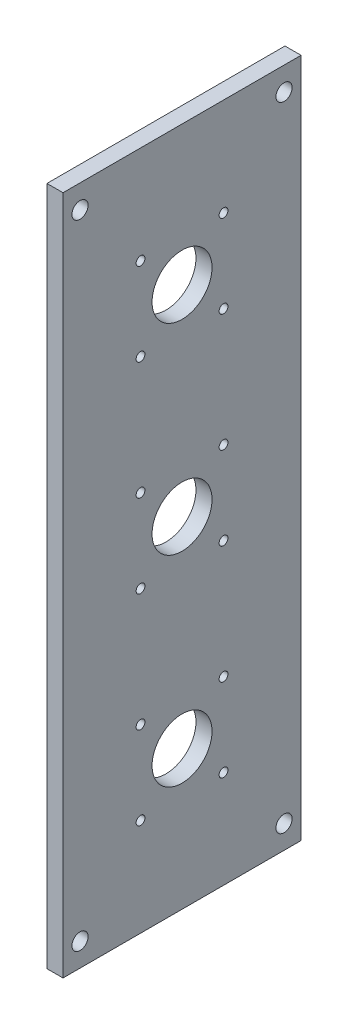
ISO-10303-21;
HEADER;
FILE_DESCRIPTION(('STEP AP214'),'2;1');
FILE_NAME('part.step','',(''),(''),'','','');
FILE_SCHEMA(('AUTOMOTIVE_DESIGN { 1 0 10303 214 1 1 1 1 }'));
ENDSEC;
DATA;
#1=APPLICATION_CONTEXT('core data for automotive mechanical design processes');
#2=APPLICATION_PROTOCOL_DEFINITION('international standard','automotive_design',2000,#1);
#3=PRODUCT_CONTEXT('',#1,'mechanical');
#4=PRODUCT('Part','Part','',(#3));
#5=PRODUCT_RELATED_PRODUCT_CATEGORY('part','',(#4));
#6=PRODUCT_DEFINITION_FORMATION('','',#4);
#7=PRODUCT_DEFINITION_CONTEXT('part definition',#1,'design');
#8=PRODUCT_DEFINITION('design','',#6,#7);
#9=PRODUCT_DEFINITION_SHAPE('','',#8);
#10=(LENGTH_UNIT() NAMED_UNIT(*) SI_UNIT(.MILLI.,.METRE.));
#11=(NAMED_UNIT(*) PLANE_ANGLE_UNIT() SI_UNIT($,.RADIAN.));
#12=(NAMED_UNIT(*) SI_UNIT($,.STERADIAN.) SOLID_ANGLE_UNIT());
#13=UNCERTAINTY_MEASURE_WITH_UNIT(LENGTH_MEASURE(1.E-05),#10,'distance_accuracy_value','');
#14=(GEOMETRIC_REPRESENTATION_CONTEXT(3) GLOBAL_UNCERTAINTY_ASSIGNED_CONTEXT((#13)) GLOBAL_UNIT_ASSIGNED_CONTEXT((#10,
#11,#12)) REPRESENTATION_CONTEXT('',''));
#15=CARTESIAN_POINT('',(0.,0.,0.));
#16=DIRECTION('',(0.,0.,1.));
#17=DIRECTION('',(1.,0.,0.));
#18=AXIS2_PLACEMENT_3D('',#15,#16,#17);
#19=CARTESIAN_POINT('',(0.,0.,0.));
#20=DIRECTION('',(-1.,0.,0.));
#21=DIRECTION('',(0.,0.,1.));
#22=AXIS2_PLACEMENT_3D('',#19,#20,#21);
#23=PLANE('',#22);
#24=CARTESIAN_POINT('',(0.,-15.5,15.5));
#25=DIRECTION('',(1.,0.,0.));
#26=DIRECTION('',(0.,0.,-1.));
#27=AXIS2_PLACEMENT_3D('',#24,#25,#26);
#28=CIRCLE('',#27,1.65);
#29=CARTESIAN_POINT('',(0.,-15.5,13.85));
#30=VERTEX_POINT('',#29);
#31=EDGE_CURVE('E251',#30,#30,#28,.T.);
#32=ORIENTED_EDGE('',*,*,#31,.F.);
#33=EDGE_LOOP('',(#32));
#34=FACE_BOUND('',#33,.T.);
#35=CARTESIAN_POINT('',(0.,15.5,15.5));
#36=DIRECTION('',(1.,0.,0.));
#37=DIRECTION('',(0.,0.,1.));
#38=AXIS2_PLACEMENT_3D('',#35,#36,#37);
#39=CIRCLE('',#38,1.65);
#40=CARTESIAN_POINT('',(0.,15.5,17.15));
#41=VERTEX_POINT('',#40);
#42=EDGE_CURVE('E262',#41,#41,#39,.T.);
#43=ORIENTED_EDGE('',*,*,#42,.F.);
#44=EDGE_LOOP('',(#43));
#45=FACE_BOUND('',#44,.T.);
#46=CARTESIAN_POINT('',(0.,15.5,-15.5));
#47=DIRECTION('',(1.,0.,0.));
#48=DIRECTION('',(0.,0.,-1.));
#49=AXIS2_PLACEMENT_3D('',#46,#47,#48);
#50=CIRCLE('',#49,1.65);
#51=CARTESIAN_POINT('',(0.,15.5,-17.15));
#52=VERTEX_POINT('',#51);
#53=EDGE_CURVE('E266',#52,#52,#50,.T.);
#54=ORIENTED_EDGE('',*,*,#53,.F.);
#55=EDGE_LOOP('',(#54));
#56=FACE_BOUND('',#55,.T.);
#57=CARTESIAN_POINT('',(0.,-15.5,-15.5));
#58=DIRECTION('',(1.,0.,0.));
#59=DIRECTION('',(0.,0.,1.));
#60=AXIS2_PLACEMENT_3D('',#57,#58,#59);
#61=CIRCLE('',#60,1.65);
#62=CARTESIAN_POINT('',(0.,-15.5,-13.85));
#63=VERTEX_POINT('',#62);
#64=EDGE_CURVE('E271',#63,#63,#61,.T.);
#65=ORIENTED_EDGE('',*,*,#64,.F.);
#66=EDGE_LOOP('',(#65));
#67=FACE_BOUND('',#66,.T.);
#68=CARTESIAN_POINT('',(0.,75.,0.));
#69=DIRECTION('',(1.,0.,0.));
#70=DIRECTION('',(0.,0.,-1.));
#71=AXIS2_PLACEMENT_3D('',#68,#69,#70);
#72=CIRCLE('',#71,11.2);
#73=CARTESIAN_POINT('',(0.,75.,-11.2));
#74=VERTEX_POINT('',#73);
#75=EDGE_CURVE('E276',#74,#74,#72,.T.);
#76=ORIENTED_EDGE('',*,*,#75,.F.);
#77=EDGE_LOOP('',(#76));
#78=FACE_BOUND('',#77,.T.);
#79=CARTESIAN_POINT('',(0.,59.5,15.5));
#80=DIRECTION('',(1.,0.,0.));
#81=DIRECTION('',(0.,0.,-1.));
#82=AXIS2_PLACEMENT_3D('',#79,#80,#81);
#83=CIRCLE('',#82,1.65);
#84=CARTESIAN_POINT('',(0.,59.5,13.85));
#85=VERTEX_POINT('',#84);
#86=EDGE_CURVE('E283',#85,#85,#83,.T.);
#87=ORIENTED_EDGE('',*,*,#86,.F.);
#88=EDGE_LOOP('',(#87));
#89=FACE_BOUND('',#88,.T.);
#90=CARTESIAN_POINT('',(0.,90.5,15.5));
#91=DIRECTION('',(1.,0.,0.));
#92=DIRECTION('',(0.,0.,1.));
#93=AXIS2_PLACEMENT_3D('',#90,#91,#92);
#94=CIRCLE('',#93,1.65);
#95=CARTESIAN_POINT('',(0.,90.5,17.15));
#96=VERTEX_POINT('',#95);
#97=EDGE_CURVE('E293',#96,#96,#94,.T.);
#98=ORIENTED_EDGE('',*,*,#97,.F.);
#99=EDGE_LOOP('',(#98));
#100=FACE_BOUND('',#99,.T.);
#101=CARTESIAN_POINT('',(0.,90.5,-15.5));
#102=DIRECTION('',(1.,0.,0.));
#103=DIRECTION('',(0.,0.,-1.));
#104=AXIS2_PLACEMENT_3D('',#101,#102,#103);
#105=CIRCLE('',#104,1.65);
#106=CARTESIAN_POINT('',(0.,90.5,-17.15));
#107=VERTEX_POINT('',#106);
#108=EDGE_CURVE('E300',#107,#107,#105,.T.);
#109=ORIENTED_EDGE('',*,*,#108,.F.);
#110=EDGE_LOOP('',(#109));
#111=FACE_BOUND('',#110,.T.);
#112=CARTESIAN_POINT('',(0.,-90.5,-15.5));
#113=DIRECTION('',(1.,0.,0.));
#114=DIRECTION('',(0.,0.,1.));
#115=AXIS2_PLACEMENT_3D('',#112,#113,#114);
#116=CIRCLE('',#115,1.65);
#117=CARTESIAN_POINT('',(0.,-90.5,-13.85));
#118=VERTEX_POINT('',#117);
#119=EDGE_CURVE('E222',#118,#118,#116,.T.);
#120=ORIENTED_EDGE('',*,*,#119,.F.);
#121=EDGE_LOOP('',(#120));
#122=FACE_BOUND('',#121,.T.);
#123=CARTESIAN_POINT('',(0.,-59.5,-15.5));
#124=DIRECTION('',(1.,0.,0.));
#125=DIRECTION('',(0.,0.,-1.));
#126=AXIS2_PLACEMENT_3D('',#123,#124,#125);
#127=CIRCLE('',#126,1.65);
#128=CARTESIAN_POINT('',(0.,-59.5,-17.15));
#129=VERTEX_POINT('',#128);
#130=EDGE_CURVE('E220',#129,#129,#127,.T.);
#131=ORIENTED_EDGE('',*,*,#130,.F.);
#132=EDGE_LOOP('',(#131));
#133=FACE_BOUND('',#132,.T.);
#134=CARTESIAN_POINT('',(0.,-59.5,15.5));
#135=DIRECTION('',(1.,0.,0.));
#136=DIRECTION('',(0.,0.,1.));
#137=AXIS2_PLACEMENT_3D('',#134,#135,#136);
#138=CIRCLE('',#137,1.65);
#139=CARTESIAN_POINT('',(0.,-59.5,17.15));
#140=VERTEX_POINT('',#139);
#141=EDGE_CURVE('E225',#140,#140,#138,.T.);
#142=ORIENTED_EDGE('',*,*,#141,.F.);
#143=EDGE_LOOP('',(#142));
#144=FACE_BOUND('',#143,.T.);
#145=CARTESIAN_POINT('',(0.,-90.5,15.5));
#146=DIRECTION('',(1.,0.,0.));
#147=DIRECTION('',(0.,0.,-1.));
#148=AXIS2_PLACEMENT_3D('',#145,#146,#147);
#149=CIRCLE('',#148,1.65);
#150=CARTESIAN_POINT('',(0.,-90.5,13.85));
#151=VERTEX_POINT('',#150);
#152=EDGE_CURVE('E246',#151,#151,#149,.T.);
#153=ORIENTED_EDGE('',*,*,#152,.F.);
#154=EDGE_LOOP('',(#153));
#155=FACE_BOUND('',#154,.T.);
#156=CARTESIAN_POINT('',(0.,-75.,0.));
#157=DIRECTION('',(1.,0.,0.));
#158=DIRECTION('',(0.,0.,-1.));
#159=AXIS2_PLACEMENT_3D('',#156,#157,#158);
#160=CIRCLE('',#159,11.2);
#161=CARTESIAN_POINT('',(0.,-75.,-11.2));
#162=VERTEX_POINT('',#161);
#163=EDGE_CURVE('E239',#162,#162,#160,.T.);
#164=ORIENTED_EDGE('',*,*,#163,.F.);
#165=EDGE_LOOP('',(#164));
#166=FACE_BOUND('',#165,.T.);
#167=CARTESIAN_POINT('',(0.,59.5,-15.5));
#168=DIRECTION('',(1.,0.,0.));
#169=DIRECTION('',(0.,0.,1.));
#170=AXIS2_PLACEMENT_3D('',#167,#168,#169);
#171=CIRCLE('',#170,1.65);
#172=CARTESIAN_POINT('',(0.,59.5,-13.85));
#173=VERTEX_POINT('',#172);
#174=EDGE_CURVE('E231',#173,#173,#171,.T.);
#175=ORIENTED_EDGE('',*,*,#174,.F.);
#176=EDGE_LOOP('',(#175));
#177=FACE_BOUND('',#176,.T.);
#178=CARTESIAN_POINT('',(0.,0.,0.));
#179=DIRECTION('',(1.,0.,0.));
#180=DIRECTION('',(0.,0.,-1.));
#181=AXIS2_PLACEMENT_3D('',#178,#179,#180);
#182=CIRCLE('',#181,11.2);
#183=CARTESIAN_POINT('',(0.,0.,-11.2));
#184=VERTEX_POINT('',#183);
#185=EDGE_CURVE('E260',#184,#184,#182,.T.);
#186=ORIENTED_EDGE('',*,*,#185,.F.);
#187=EDGE_LOOP('',(#186));
#188=FACE_BOUND('',#187,.T.);
#189=CARTESIAN_POINT('',(0.,118.2625,38.1));
#190=DIRECTION('',(1.,0.,0.));
#191=DIRECTION('',(0.,0.,-1.));
#192=AXIS2_PLACEMENT_3D('',#189,#190,#191);
#193=CIRCLE('',#192,3.0226);
#194=CARTESIAN_POINT('',(0.,118.2625,35.0774));
#195=VERTEX_POINT('',#194);
#196=EDGE_CURVE('E323',#195,#195,#193,.T.);
#197=ORIENTED_EDGE('',*,*,#196,.F.);
#198=EDGE_LOOP('',(#197));
#199=FACE_BOUND('',#198,.T.);
#200=DIRECTION('',(0.,0.,1.));
#201=VECTOR('',#200,1.);
#202=CARTESIAN_POINT('',(0.,127.,-44.45));
#203=LINE('',#202,#201);
#204=CARTESIAN_POINT('',(0.,127.,-44.45));
#205=VERTEX_POINT('',#204);
#206=CARTESIAN_POINT('',(0.,127.,44.45));
#207=VERTEX_POINT('',#206);
#208=EDGE_CURVE('E102',#205,#207,#203,.T.);
#209=ORIENTED_EDGE('',*,*,#208,.T.);
#210=DIRECTION('',(0.,-1.,0.));
#211=VECTOR('',#210,1.);
#212=CARTESIAN_POINT('',(0.,-127.,44.45));
#213=LINE('',#212,#211);
#214=CARTESIAN_POINT('',(0.,-127.,44.45));
#215=VERTEX_POINT('',#214);
#216=EDGE_CURVE('E108',#207,#215,#213,.T.);
#217=ORIENTED_EDGE('',*,*,#216,.T.);
#218=DIRECTION('',(0.,0.,-1.));
#219=VECTOR('',#218,1.);
#220=CARTESIAN_POINT('',(0.,-127.,-44.45));
#221=LINE('',#220,#219);
#222=CARTESIAN_POINT('',(0.,-127.,-44.45));
#223=VERTEX_POINT('',#222);
#224=EDGE_CURVE('E88',#215,#223,#221,.T.);
#225=ORIENTED_EDGE('',*,*,#224,.T.);
#226=DIRECTION('',(0.,1.,0.));
#227=VECTOR('',#226,1.);
#228=CARTESIAN_POINT('',(0.,-127.,-44.45));
#229=LINE('',#228,#227);
#230=EDGE_CURVE('E99',#223,#205,#229,.T.);
#231=ORIENTED_EDGE('',*,*,#230,.T.);
#232=EDGE_LOOP('',(#209,#217,#225,#231));
#233=FACE_BOUND('',#232,.T.);
#234=CARTESIAN_POINT('',(0.,118.2625,-38.1));
#235=DIRECTION('',(1.,0.,0.));
#236=DIRECTION('',(0.,0.,-1.));
#237=AXIS2_PLACEMENT_3D('',#234,#235,#236);
#238=CIRCLE('',#237,3.0226);
#239=CARTESIAN_POINT('',(0.,118.2625,-41.1226));
#240=VERTEX_POINT('',#239);
#241=EDGE_CURVE('E316',#240,#240,#238,.T.);
#242=ORIENTED_EDGE('',*,*,#241,.F.);
#243=EDGE_LOOP('',(#242));
#244=FACE_BOUND('',#243,.T.);
#245=CARTESIAN_POINT('',(0.,-118.2625,-38.1));
#246=DIRECTION('',(1.,0.,0.));
#247=DIRECTION('',(0.,0.,-1.));
#248=AXIS2_PLACEMENT_3D('',#245,#246,#247);
#249=CIRCLE('',#248,3.0226);
#250=CARTESIAN_POINT('',(0.,-118.2625,-41.1226));
#251=VERTEX_POINT('',#250);
#252=EDGE_CURVE('E312',#251,#251,#249,.T.);
#253=ORIENTED_EDGE('',*,*,#252,.F.);
#254=EDGE_LOOP('',(#253));
#255=FACE_BOUND('',#254,.T.);
#256=CARTESIAN_POINT('',(0.,-118.2625,38.1));
#257=DIRECTION('',(1.,0.,0.));
#258=DIRECTION('',(0.,0.,-1.));
#259=AXIS2_PLACEMENT_3D('',#256,#257,#258);
#260=CIRCLE('',#259,3.0226);
#261=CARTESIAN_POINT('',(0.,-118.2625,35.0774));
#262=VERTEX_POINT('',#261);
#263=EDGE_CURVE('E304',#262,#262,#260,.T.);
#264=ORIENTED_EDGE('',*,*,#263,.F.);
#265=EDGE_LOOP('',(#264));
#266=FACE_BOUND('',#265,.T.);
#267=ADVANCED_FACE('F39',(#34,#45,#56,#67,#78,#89,#100,#111,#122,#133,#144,#155,#166,#177,#188,
#199,#233,#244,#255,#266),#23,.F.);
#268=CARTESIAN_POINT('',(-6.,127.,-44.45));
#269=DIRECTION('',(0.,1.,0.));
#270=DIRECTION('',(0.,0.,1.));
#271=AXIS2_PLACEMENT_3D('',#268,#269,#270);
#272=PLANE('',#271);
#273=ORIENTED_EDGE('',*,*,#208,.F.);
#274=DIRECTION('',(1.,0.,0.));
#275=VECTOR('',#274,1.);
#276=CARTESIAN_POINT('',(-6.,127.,-44.45));
#277=LINE('',#276,#275);
#278=CARTESIAN_POINT('',(-6.,127.,-44.45));
#279=VERTEX_POINT('',#278);
#280=EDGE_CURVE('E11',#279,#205,#277,.T.);
#281=ORIENTED_EDGE('',*,*,#280,.F.);
#282=DIRECTION('',(0.,0.,1.));
#283=VECTOR('',#282,1.);
#284=CARTESIAN_POINT('',(-6.,127.,-44.45));
#285=LINE('',#284,#283);
#286=CARTESIAN_POINT('',(-6.,127.,44.45));
#287=VERTEX_POINT('',#286);
#288=EDGE_CURVE('E96',#279,#287,#285,.T.);
#289=ORIENTED_EDGE('',*,*,#288,.T.);
#290=DIRECTION('',(1.,0.,0.));
#291=VECTOR('',#290,1.);
#292=CARTESIAN_POINT('',(-6.,127.,44.45));
#293=LINE('',#292,#291);
#294=EDGE_CURVE('E43',#287,#207,#293,.T.);
#295=ORIENTED_EDGE('',*,*,#294,.T.);
#296=EDGE_LOOP('',(#273,#281,#289,#295));
#297=FACE_BOUND('',#296,.T.);
#298=ADVANCED_FACE('F41',(#297),#272,.T.);
#299=CARTESIAN_POINT('',(-6.,-127.,-44.45));
#300=DIRECTION('',(0.,0.,-1.));
#301=DIRECTION('',(-1.,0.,0.));
#302=AXIS2_PLACEMENT_3D('',#299,#300,#301);
#303=PLANE('',#302);
#304=ORIENTED_EDGE('',*,*,#230,.F.);
#305=DIRECTION('',(1.,0.,0.));
#306=VECTOR('',#305,1.);
#307=CARTESIAN_POINT('',(-6.,-127.,-44.45));
#308=LINE('',#307,#306);
#309=CARTESIAN_POINT('',(-6.,-127.,-44.45));
#310=VERTEX_POINT('',#309);
#311=EDGE_CURVE('E47',#310,#223,#308,.T.);
#312=ORIENTED_EDGE('',*,*,#311,.F.);
#313=DIRECTION('',(0.,1.,0.));
#314=VECTOR('',#313,1.);
#315=CARTESIAN_POINT('',(-6.,-127.,-44.45));
#316=LINE('',#315,#314);
#317=EDGE_CURVE('E92',#310,#279,#316,.T.);
#318=ORIENTED_EDGE('',*,*,#317,.T.);
#319=ORIENTED_EDGE('',*,*,#280,.T.);
#320=EDGE_LOOP('',(#304,#312,#318,#319));
#321=FACE_BOUND('',#320,.T.);
#322=ADVANCED_FACE('F116',(#321),#303,.T.);
#323=CARTESIAN_POINT('',(-6.,-127.,-44.45));
#324=DIRECTION('',(0.,-1.,0.));
#325=DIRECTION('',(0.,0.,-1.));
#326=AXIS2_PLACEMENT_3D('',#323,#324,#325);
#327=PLANE('',#326);
#328=ORIENTED_EDGE('',*,*,#224,.F.);
#329=DIRECTION('',(1.,0.,0.));
#330=VECTOR('',#329,1.);
#331=CARTESIAN_POINT('',(-6.,-127.,44.45));
#332=LINE('',#331,#330);
#333=CARTESIAN_POINT('',(-6.,-127.,44.45));
#334=VERTEX_POINT('',#333);
#335=EDGE_CURVE('E83',#334,#215,#332,.T.);
#336=ORIENTED_EDGE('',*,*,#335,.F.);
#337=DIRECTION('',(0.,0.,-1.));
#338=VECTOR('',#337,1.);
#339=CARTESIAN_POINT('',(-6.,-127.,-44.45));
#340=LINE('',#339,#338);
#341=EDGE_CURVE('E90',#334,#310,#340,.T.);
#342=ORIENTED_EDGE('',*,*,#341,.T.);
#343=ORIENTED_EDGE('',*,*,#311,.T.);
#344=EDGE_LOOP('',(#328,#336,#342,#343));
#345=FACE_BOUND('',#344,.T.);
#346=ADVANCED_FACE('F89',(#345),#327,.T.);
#347=CARTESIAN_POINT('',(-6.,-127.,44.45));
#348=DIRECTION('',(0.,0.,1.));
#349=DIRECTION('',(1.,0.,0.));
#350=AXIS2_PLACEMENT_3D('',#347,#348,#349);
#351=PLANE('',#350);
#352=ORIENTED_EDGE('',*,*,#216,.F.);
#353=ORIENTED_EDGE('',*,*,#294,.F.);
#354=DIRECTION('',(0.,-1.,0.));
#355=VECTOR('',#354,1.);
#356=CARTESIAN_POINT('',(-6.,-127.,44.45));
#357=LINE('',#356,#355);
#358=EDGE_CURVE('E93',#287,#334,#357,.T.);
#359=ORIENTED_EDGE('',*,*,#358,.T.);
#360=ORIENTED_EDGE('',*,*,#335,.T.);
#361=EDGE_LOOP('',(#352,#353,#359,#360));
#362=FACE_BOUND('',#361,.T.);
#363=ADVANCED_FACE('F97',(#362),#351,.T.);
#364=CARTESIAN_POINT('',(-6.,0.,0.));
#365=DIRECTION('',(-1.,0.,0.));
#366=DIRECTION('',(0.,0.,1.));
#367=AXIS2_PLACEMENT_3D('',#364,#365,#366);
#368=PLANE('',#367);
#369=CARTESIAN_POINT('',(-6.,-15.5,15.5));
#370=DIRECTION('',(1.,0.,0.));
#371=DIRECTION('',(0.,0.,-1.));
#372=AXIS2_PLACEMENT_3D('',#369,#370,#371);
#373=CIRCLE('',#372,1.65);
#374=CARTESIAN_POINT('',(-6.,-15.5,13.85));
#375=VERTEX_POINT('',#374);
#376=EDGE_CURVE('E259',#375,#375,#373,.T.);
#377=ORIENTED_EDGE('',*,*,#376,.T.);
#378=EDGE_LOOP('',(#377));
#379=FACE_BOUND('',#378,.T.);
#380=CARTESIAN_POINT('',(-6.,15.5,15.5));
#381=DIRECTION('',(1.,0.,0.));
#382=DIRECTION('',(0.,0.,1.));
#383=AXIS2_PLACEMENT_3D('',#380,#381,#382);
#384=CIRCLE('',#383,1.65);
#385=CARTESIAN_POINT('',(-6.,15.5,17.15));
#386=VERTEX_POINT('',#385);
#387=EDGE_CURVE('E261',#386,#386,#384,.T.);
#388=ORIENTED_EDGE('',*,*,#387,.T.);
#389=EDGE_LOOP('',(#388));
#390=FACE_BOUND('',#389,.T.);
#391=CARTESIAN_POINT('',(-6.,15.5,-15.5));
#392=DIRECTION('',(1.,0.,0.));
#393=DIRECTION('',(0.,0.,-1.));
#394=AXIS2_PLACEMENT_3D('',#391,#392,#393);
#395=CIRCLE('',#394,1.65);
#396=CARTESIAN_POINT('',(-6.,15.5,-17.15));
#397=VERTEX_POINT('',#396);
#398=EDGE_CURVE('E267',#397,#397,#395,.T.);
#399=ORIENTED_EDGE('',*,*,#398,.T.);
#400=EDGE_LOOP('',(#399));
#401=FACE_BOUND('',#400,.T.);
#402=CARTESIAN_POINT('',(-6.,-15.5,-15.5));
#403=DIRECTION('',(1.,0.,0.));
#404=DIRECTION('',(0.,0.,1.));
#405=AXIS2_PLACEMENT_3D('',#402,#403,#404);
#406=CIRCLE('',#405,1.65);
#407=CARTESIAN_POINT('',(-6.,-15.5,-13.85));
#408=VERTEX_POINT('',#407);
#409=EDGE_CURVE('E277',#408,#408,#406,.T.);
#410=ORIENTED_EDGE('',*,*,#409,.T.);
#411=EDGE_LOOP('',(#410));
#412=FACE_BOUND('',#411,.T.);
#413=CARTESIAN_POINT('',(-6.,75.,0.));
#414=DIRECTION('',(1.,0.,0.));
#415=DIRECTION('',(0.,0.,-1.));
#416=AXIS2_PLACEMENT_3D('',#413,#414,#415);
#417=CIRCLE('',#416,11.2);
#418=CARTESIAN_POINT('',(-6.,75.,-11.2));
#419=VERTEX_POINT('',#418);
#420=EDGE_CURVE('E284',#419,#419,#417,.T.);
#421=ORIENTED_EDGE('',*,*,#420,.T.);
#422=EDGE_LOOP('',(#421));
#423=FACE_BOUND('',#422,.T.);
#424=CARTESIAN_POINT('',(-6.,59.5,15.5));
#425=DIRECTION('',(1.,0.,0.));
#426=DIRECTION('',(0.,0.,-1.));
#427=AXIS2_PLACEMENT_3D('',#424,#425,#426);
#428=CIRCLE('',#427,1.65);
#429=CARTESIAN_POINT('',(-6.,59.5,13.85));
#430=VERTEX_POINT('',#429);
#431=EDGE_CURVE('E290',#430,#430,#428,.T.);
#432=ORIENTED_EDGE('',*,*,#431,.T.);
#433=EDGE_LOOP('',(#432));
#434=FACE_BOUND('',#433,.T.);
#435=CARTESIAN_POINT('',(-6.,90.5,15.5));
#436=DIRECTION('',(1.,0.,0.));
#437=DIRECTION('',(0.,0.,1.));
#438=AXIS2_PLACEMENT_3D('',#435,#436,#437);
#439=CIRCLE('',#438,1.65);
#440=CARTESIAN_POINT('',(-6.,90.5,17.15));
#441=VERTEX_POINT('',#440);
#442=EDGE_CURVE('E295',#441,#441,#439,.T.);
#443=ORIENTED_EDGE('',*,*,#442,.T.);
#444=EDGE_LOOP('',(#443));
#445=FACE_BOUND('',#444,.T.);
#446=CARTESIAN_POINT('',(-6.,90.5,-15.5));
#447=DIRECTION('',(1.,0.,0.));
#448=DIRECTION('',(0.,0.,-1.));
#449=AXIS2_PLACEMENT_3D('',#446,#447,#448);
#450=CIRCLE('',#449,1.65);
#451=CARTESIAN_POINT('',(-6.,90.5,-17.15));
#452=VERTEX_POINT('',#451);
#453=EDGE_CURVE('E236',#452,#452,#450,.T.);
#454=ORIENTED_EDGE('',*,*,#453,.T.);
#455=EDGE_LOOP('',(#454));
#456=FACE_BOUND('',#455,.T.);
#457=CARTESIAN_POINT('',(-6.,-90.5,-15.5));
#458=DIRECTION('',(1.,0.,0.));
#459=DIRECTION('',(0.,0.,1.));
#460=AXIS2_PLACEMENT_3D('',#457,#458,#459);
#461=CIRCLE('',#460,1.65);
#462=CARTESIAN_POINT('',(-6.,-90.5,-13.85));
#463=VERTEX_POINT('',#462);
#464=EDGE_CURVE('E229',#463,#463,#461,.T.);
#465=ORIENTED_EDGE('',*,*,#464,.T.);
#466=EDGE_LOOP('',(#465));
#467=FACE_BOUND('',#466,.T.);
#468=CARTESIAN_POINT('',(-6.,-59.5,-15.5));
#469=DIRECTION('',(1.,0.,0.));
#470=DIRECTION('',(0.,0.,-1.));
#471=AXIS2_PLACEMENT_3D('',#468,#469,#470);
#472=CIRCLE('',#471,1.65);
#473=CARTESIAN_POINT('',(-6.,-59.5,-17.15));
#474=VERTEX_POINT('',#473);
#475=EDGE_CURVE('E213',#474,#474,#472,.T.);
#476=ORIENTED_EDGE('',*,*,#475,.T.);
#477=EDGE_LOOP('',(#476));
#478=FACE_BOUND('',#477,.T.);
#479=CARTESIAN_POINT('',(-6.,-59.5,15.5));
#480=DIRECTION('',(1.,0.,0.));
#481=DIRECTION('',(0.,0.,1.));
#482=AXIS2_PLACEMENT_3D('',#479,#480,#481);
#483=CIRCLE('',#482,1.65);
#484=CARTESIAN_POINT('',(-6.,-59.5,17.15));
#485=VERTEX_POINT('',#484);
#486=EDGE_CURVE('E218',#485,#485,#483,.T.);
#487=ORIENTED_EDGE('',*,*,#486,.T.);
#488=EDGE_LOOP('',(#487));
#489=FACE_BOUND('',#488,.T.);
#490=CARTESIAN_POINT('',(-6.,-90.5,15.5));
#491=DIRECTION('',(1.,0.,0.));
#492=DIRECTION('',(0.,0.,-1.));
#493=AXIS2_PLACEMENT_3D('',#490,#491,#492);
#494=CIRCLE('',#493,1.65);
#495=CARTESIAN_POINT('',(-6.,-90.5,13.85));
#496=VERTEX_POINT('',#495);
#497=EDGE_CURVE('E248',#496,#496,#494,.T.);
#498=ORIENTED_EDGE('',*,*,#497,.T.);
#499=EDGE_LOOP('',(#498));
#500=FACE_BOUND('',#499,.T.);
#501=CARTESIAN_POINT('',(-6.,-75.,0.));
#502=DIRECTION('',(1.,0.,0.));
#503=DIRECTION('',(0.,0.,-1.));
#504=AXIS2_PLACEMENT_3D('',#501,#502,#503);
#505=CIRCLE('',#504,11.2);
#506=CARTESIAN_POINT('',(-6.,-75.,-11.2));
#507=VERTEX_POINT('',#506);
#508=EDGE_CURVE('E243',#507,#507,#505,.T.);
#509=ORIENTED_EDGE('',*,*,#508,.T.);
#510=EDGE_LOOP('',(#509));
#511=FACE_BOUND('',#510,.T.);
#512=CARTESIAN_POINT('',(-6.,59.5,-15.5));
#513=DIRECTION('',(1.,0.,0.));
#514=DIRECTION('',(0.,0.,1.));
#515=AXIS2_PLACEMENT_3D('',#512,#513,#514);
#516=CIRCLE('',#515,1.65);
#517=CARTESIAN_POINT('',(-6.,59.5,-13.85));
#518=VERTEX_POINT('',#517);
#519=EDGE_CURVE('E240',#518,#518,#516,.T.);
#520=ORIENTED_EDGE('',*,*,#519,.T.);
#521=EDGE_LOOP('',(#520));
#522=FACE_BOUND('',#521,.T.);
#523=CARTESIAN_POINT('',(-6.,0.,0.));
#524=DIRECTION('',(1.,0.,0.));
#525=DIRECTION('',(0.,0.,-1.));
#526=AXIS2_PLACEMENT_3D('',#523,#524,#525);
#527=CIRCLE('',#526,11.2);
#528=CARTESIAN_POINT('',(-6.,0.,-11.2));
#529=VERTEX_POINT('',#528);
#530=EDGE_CURVE('E305',#529,#529,#527,.T.);
#531=ORIENTED_EDGE('',*,*,#530,.T.);
#532=EDGE_LOOP('',(#531));
#533=FACE_BOUND('',#532,.T.);
#534=CARTESIAN_POINT('',(-6.,-118.2625,38.1));
#535=DIRECTION('',(-1.,0.,0.));
#536=DIRECTION('',(0.,0.,1.));
#537=AXIS2_PLACEMENT_3D('',#534,#535,#536);
#538=CIRCLE('',#537,3.0226);
#539=CARTESIAN_POINT('',(-6.,-118.2625,41.1226));
#540=VERTEX_POINT('',#539);
#541=EDGE_CURVE('E309',#540,#540,#538,.T.);
#542=ORIENTED_EDGE('',*,*,#541,.F.);
#543=EDGE_LOOP('',(#542));
#544=FACE_BOUND('',#543,.T.);
#545=CARTESIAN_POINT('',(-6.,-118.2625,-38.1));
#546=DIRECTION('',(-1.,0.,0.));
#547=DIRECTION('',(0.,0.,1.));
#548=AXIS2_PLACEMENT_3D('',#545,#546,#547);
#549=CIRCLE('',#548,3.0226);
#550=CARTESIAN_POINT('',(-6.,-118.2625,-35.0774));
#551=VERTEX_POINT('',#550);
#552=EDGE_CURVE('E317',#551,#551,#549,.T.);
#553=ORIENTED_EDGE('',*,*,#552,.F.);
#554=EDGE_LOOP('',(#553));
#555=FACE_BOUND('',#554,.T.);
#556=CARTESIAN_POINT('',(-6.,118.2625,-38.1));
#557=DIRECTION('',(-1.,0.,0.));
#558=DIRECTION('',(0.,0.,1.));
#559=AXIS2_PLACEMENT_3D('',#556,#557,#558);
#560=CIRCLE('',#559,3.0226);
#561=CARTESIAN_POINT('',(-6.,118.2625,-35.0774));
#562=VERTEX_POINT('',#561);
#563=EDGE_CURVE('E325',#562,#562,#560,.T.);
#564=ORIENTED_EDGE('',*,*,#563,.F.);
#565=EDGE_LOOP('',(#564));
#566=FACE_BOUND('',#565,.T.);
#567=CARTESIAN_POINT('',(-6.,118.2625,38.1));
#568=DIRECTION('',(-1.,0.,0.));
#569=DIRECTION('',(0.,0.,1.));
#570=AXIS2_PLACEMENT_3D('',#567,#568,#569);
#571=CIRCLE('',#570,3.0226);
#572=CARTESIAN_POINT('',(-6.,118.2625,41.1226));
#573=VERTEX_POINT('',#572);
#574=EDGE_CURVE('E107',#573,#573,#571,.T.);
#575=ORIENTED_EDGE('',*,*,#574,.F.);
#576=EDGE_LOOP('',(#575));
#577=FACE_BOUND('',#576,.T.);
#578=ORIENTED_EDGE('',*,*,#288,.F.);
#579=ORIENTED_EDGE('',*,*,#317,.F.);
#580=ORIENTED_EDGE('',*,*,#341,.F.);
#581=ORIENTED_EDGE('',*,*,#358,.F.);
#582=EDGE_LOOP('',(#578,#579,#580,#581));
#583=FACE_BOUND('',#582,.T.);
#584=ADVANCED_FACE('F95',(#379,#390,#401,#412,#423,#434,#445,#456,#467,#478,#489,#500,#511,#522,
#533,#544,#555,#566,#577,#583),#368,.T.);
#585=CARTESIAN_POINT('',(0.,118.2625,38.1));
#586=DIRECTION('',(1.,0.,0.));
#587=DIRECTION('',(0.,0.,-1.));
#588=AXIS2_PLACEMENT_3D('',#585,#586,#587);
#589=CYLINDRICAL_SURFACE('',#588,3.0226);
#590=ORIENTED_EDGE('',*,*,#196,.T.);
#591=EDGE_LOOP('',(#590));
#592=FACE_BOUND('',#591,.T.);
#593=ORIENTED_EDGE('',*,*,#574,.T.);
#594=EDGE_LOOP('',(#593));
#595=FACE_BOUND('',#594,.T.);
#596=ADVANCED_FACE('F133',(#592,#595),#589,.F.);
#597=CARTESIAN_POINT('',(0.,118.2625,-38.1));
#598=DIRECTION('',(1.,0.,0.));
#599=DIRECTION('',(0.,0.,-1.));
#600=AXIS2_PLACEMENT_3D('',#597,#598,#599);
#601=CYLINDRICAL_SURFACE('',#600,3.0226);
#602=ORIENTED_EDGE('',*,*,#241,.T.);
#603=EDGE_LOOP('',(#602));
#604=FACE_BOUND('',#603,.T.);
#605=ORIENTED_EDGE('',*,*,#563,.T.);
#606=EDGE_LOOP('',(#605));
#607=FACE_BOUND('',#606,.T.);
#608=ADVANCED_FACE('F138',(#604,#607),#601,.F.);
#609=CARTESIAN_POINT('',(0.,-118.2625,-38.1));
#610=DIRECTION('',(1.,0.,0.));
#611=DIRECTION('',(0.,0.,-1.));
#612=AXIS2_PLACEMENT_3D('',#609,#610,#611);
#613=CYLINDRICAL_SURFACE('',#612,3.0226);
#614=ORIENTED_EDGE('',*,*,#252,.T.);
#615=EDGE_LOOP('',(#614));
#616=FACE_BOUND('',#615,.T.);
#617=ORIENTED_EDGE('',*,*,#552,.T.);
#618=EDGE_LOOP('',(#617));
#619=FACE_BOUND('',#618,.T.);
#620=ADVANCED_FACE('F141',(#616,#619),#613,.F.);
#621=CARTESIAN_POINT('',(0.,-118.2625,38.1));
#622=DIRECTION('',(1.,0.,0.));
#623=DIRECTION('',(0.,0.,-1.));
#624=AXIS2_PLACEMENT_3D('',#621,#622,#623);
#625=CYLINDRICAL_SURFACE('',#624,3.0226);
#626=ORIENTED_EDGE('',*,*,#263,.T.);
#627=EDGE_LOOP('',(#626));
#628=FACE_BOUND('',#627,.T.);
#629=ORIENTED_EDGE('',*,*,#541,.T.);
#630=EDGE_LOOP('',(#629));
#631=FACE_BOUND('',#630,.T.);
#632=ADVANCED_FACE('F150',(#628,#631),#625,.F.);
#633=CARTESIAN_POINT('',(-6.,0.,0.));
#634=DIRECTION('',(1.,0.,0.));
#635=DIRECTION('',(0.,0.,-1.));
#636=AXIS2_PLACEMENT_3D('',#633,#634,#635);
#637=CYLINDRICAL_SURFACE('',#636,11.2);
#638=ORIENTED_EDGE('',*,*,#530,.F.);
#639=EDGE_LOOP('',(#638));
#640=FACE_BOUND('',#639,.T.);
#641=ORIENTED_EDGE('',*,*,#185,.T.);
#642=EDGE_LOOP('',(#641));
#643=FACE_BOUND('',#642,.T.);
#644=ADVANCED_FACE('F148',(#640,#643),#637,.F.);
#645=CARTESIAN_POINT('',(-6.,59.5,-15.5));
#646=DIRECTION('',(1.,0.,0.));
#647=DIRECTION('',(0.,0.,-1.));
#648=AXIS2_PLACEMENT_3D('',#645,#646,#647);
#649=CYLINDRICAL_SURFACE('',#648,1.65);
#650=ORIENTED_EDGE('',*,*,#519,.F.);
#651=EDGE_LOOP('',(#650));
#652=FACE_BOUND('',#651,.T.);
#653=ORIENTED_EDGE('',*,*,#174,.T.);
#654=EDGE_LOOP('',(#653));
#655=FACE_BOUND('',#654,.T.);
#656=ADVANCED_FACE('F151',(#652,#655),#649,.F.);
#657=CARTESIAN_POINT('',(-6.,-75.,0.));
#658=DIRECTION('',(1.,0.,0.));
#659=DIRECTION('',(0.,0.,-1.));
#660=AXIS2_PLACEMENT_3D('',#657,#658,#659);
#661=CYLINDRICAL_SURFACE('',#660,11.2);
#662=ORIENTED_EDGE('',*,*,#508,.F.);
#663=EDGE_LOOP('',(#662));
#664=FACE_BOUND('',#663,.T.);
#665=ORIENTED_EDGE('',*,*,#163,.T.);
#666=EDGE_LOOP('',(#665));
#667=FACE_BOUND('',#666,.T.);
#668=ADVANCED_FACE('F199',(#664,#667),#661,.F.);
#669=CARTESIAN_POINT('',(-6.,-90.5,15.5));
#670=DIRECTION('',(1.,0.,0.));
#671=DIRECTION('',(0.,0.,-1.));
#672=AXIS2_PLACEMENT_3D('',#669,#670,#671);
#673=CYLINDRICAL_SURFACE('',#672,1.65);
#674=ORIENTED_EDGE('',*,*,#497,.F.);
#675=EDGE_LOOP('',(#674));
#676=FACE_BOUND('',#675,.T.);
#677=ORIENTED_EDGE('',*,*,#152,.T.);
#678=EDGE_LOOP('',(#677));
#679=FACE_BOUND('',#678,.T.);
#680=ADVANCED_FACE('F194',(#676,#679),#673,.F.);
#681=CARTESIAN_POINT('',(-6.,-59.5,15.5));
#682=DIRECTION('',(1.,0.,0.));
#683=DIRECTION('',(0.,0.,-1.));
#684=AXIS2_PLACEMENT_3D('',#681,#682,#683);
#685=CYLINDRICAL_SURFACE('',#684,1.65);
#686=ORIENTED_EDGE('',*,*,#486,.F.);
#687=EDGE_LOOP('',(#686));
#688=FACE_BOUND('',#687,.T.);
#689=ORIENTED_EDGE('',*,*,#141,.T.);
#690=EDGE_LOOP('',(#689));
#691=FACE_BOUND('',#690,.T.);
#692=ADVANCED_FACE('F186',(#688,#691),#685,.F.);
#693=CARTESIAN_POINT('',(-6.,-59.5,-15.5));
#694=DIRECTION('',(1.,0.,0.));
#695=DIRECTION('',(0.,0.,-1.));
#696=AXIS2_PLACEMENT_3D('',#693,#694,#695);
#697=CYLINDRICAL_SURFACE('',#696,1.65);
#698=ORIENTED_EDGE('',*,*,#475,.F.);
#699=EDGE_LOOP('',(#698));
#700=FACE_BOUND('',#699,.T.);
#701=ORIENTED_EDGE('',*,*,#130,.T.);
#702=EDGE_LOOP('',(#701));
#703=FACE_BOUND('',#702,.T.);
#704=ADVANCED_FACE('F195',(#700,#703),#697,.F.);
#705=CARTESIAN_POINT('',(-6.,-90.5,-15.5));
#706=DIRECTION('',(1.,0.,0.));
#707=DIRECTION('',(0.,0.,-1.));
#708=AXIS2_PLACEMENT_3D('',#705,#706,#707);
#709=CYLINDRICAL_SURFACE('',#708,1.65);
#710=ORIENTED_EDGE('',*,*,#464,.F.);
#711=EDGE_LOOP('',(#710));
#712=FACE_BOUND('',#711,.T.);
#713=ORIENTED_EDGE('',*,*,#119,.T.);
#714=EDGE_LOOP('',(#713));
#715=FACE_BOUND('',#714,.T.);
#716=ADVANCED_FACE('F157',(#712,#715),#709,.F.);
#717=CARTESIAN_POINT('',(-6.,90.5,-15.5));
#718=DIRECTION('',(1.,0.,0.));
#719=DIRECTION('',(0.,0.,-1.));
#720=AXIS2_PLACEMENT_3D('',#717,#718,#719);
#721=CYLINDRICAL_SURFACE('',#720,1.65);
#722=ORIENTED_EDGE('',*,*,#453,.F.);
#723=EDGE_LOOP('',(#722));
#724=FACE_BOUND('',#723,.T.);
#725=ORIENTED_EDGE('',*,*,#108,.T.);
#726=EDGE_LOOP('',(#725));
#727=FACE_BOUND('',#726,.T.);
#728=ADVANCED_FACE('F159',(#724,#727),#721,.F.);
#729=CARTESIAN_POINT('',(-6.,90.5,15.5));
#730=DIRECTION('',(1.,0.,0.));
#731=DIRECTION('',(0.,0.,-1.));
#732=AXIS2_PLACEMENT_3D('',#729,#730,#731);
#733=CYLINDRICAL_SURFACE('',#732,1.65);
#734=ORIENTED_EDGE('',*,*,#442,.F.);
#735=EDGE_LOOP('',(#734));
#736=FACE_BOUND('',#735,.T.);
#737=ORIENTED_EDGE('',*,*,#97,.T.);
#738=EDGE_LOOP('',(#737));
#739=FACE_BOUND('',#738,.T.);
#740=ADVANCED_FACE('F158',(#736,#739),#733,.F.);
#741=CARTESIAN_POINT('',(-6.,59.5,15.5));
#742=DIRECTION('',(1.,0.,0.));
#743=DIRECTION('',(0.,0.,-1.));
#744=AXIS2_PLACEMENT_3D('',#741,#742,#743);
#745=CYLINDRICAL_SURFACE('',#744,1.65);
#746=ORIENTED_EDGE('',*,*,#431,.F.);
#747=EDGE_LOOP('',(#746));
#748=FACE_BOUND('',#747,.T.);
#749=ORIENTED_EDGE('',*,*,#86,.T.);
#750=EDGE_LOOP('',(#749));
#751=FACE_BOUND('',#750,.T.);
#752=ADVANCED_FACE('F165',(#748,#751),#745,.F.);
#753=CARTESIAN_POINT('',(-6.,75.,0.));
#754=DIRECTION('',(1.,0.,0.));
#755=DIRECTION('',(0.,0.,-1.));
#756=AXIS2_PLACEMENT_3D('',#753,#754,#755);
#757=CYLINDRICAL_SURFACE('',#756,11.2);
#758=ORIENTED_EDGE('',*,*,#420,.F.);
#759=EDGE_LOOP('',(#758));
#760=FACE_BOUND('',#759,.T.);
#761=ORIENTED_EDGE('',*,*,#75,.T.);
#762=EDGE_LOOP('',(#761));
#763=FACE_BOUND('',#762,.T.);
#764=ADVANCED_FACE('F166',(#760,#763),#757,.F.);
#765=CARTESIAN_POINT('',(-6.,-15.5,-15.5));
#766=DIRECTION('',(1.,0.,0.));
#767=DIRECTION('',(0.,0.,-1.));
#768=AXIS2_PLACEMENT_3D('',#765,#766,#767);
#769=CYLINDRICAL_SURFACE('',#768,1.65);
#770=ORIENTED_EDGE('',*,*,#409,.F.);
#771=EDGE_LOOP('',(#770));
#772=FACE_BOUND('',#771,.T.);
#773=ORIENTED_EDGE('',*,*,#64,.T.);
#774=EDGE_LOOP('',(#773));
#775=FACE_BOUND('',#774,.T.);
#776=ADVANCED_FACE('F175',(#772,#775),#769,.F.);
#777=CARTESIAN_POINT('',(-6.,15.5,-15.5));
#778=DIRECTION('',(1.,0.,0.));
#779=DIRECTION('',(0.,0.,-1.));
#780=AXIS2_PLACEMENT_3D('',#777,#778,#779);
#781=CYLINDRICAL_SURFACE('',#780,1.65);
#782=ORIENTED_EDGE('',*,*,#398,.F.);
#783=EDGE_LOOP('',(#782));
#784=FACE_BOUND('',#783,.T.);
#785=ORIENTED_EDGE('',*,*,#53,.T.);
#786=EDGE_LOOP('',(#785));
#787=FACE_BOUND('',#786,.T.);
#788=ADVANCED_FACE('F176',(#784,#787),#781,.F.);
#789=CARTESIAN_POINT('',(-6.,15.5,15.5));
#790=DIRECTION('',(1.,0.,0.));
#791=DIRECTION('',(0.,0.,-1.));
#792=AXIS2_PLACEMENT_3D('',#789,#790,#791);
#793=CYLINDRICAL_SURFACE('',#792,1.65);
#794=ORIENTED_EDGE('',*,*,#387,.F.);
#795=EDGE_LOOP('',(#794));
#796=FACE_BOUND('',#795,.T.);
#797=ORIENTED_EDGE('',*,*,#42,.T.);
#798=EDGE_LOOP('',(#797));
#799=FACE_BOUND('',#798,.T.);
#800=ADVANCED_FACE('F179',(#796,#799),#793,.F.);
#801=CARTESIAN_POINT('',(-6.,-15.5,15.5));
#802=DIRECTION('',(1.,0.,0.));
#803=DIRECTION('',(0.,0.,-1.));
#804=AXIS2_PLACEMENT_3D('',#801,#802,#803);
#805=CYLINDRICAL_SURFACE('',#804,1.65);
#806=ORIENTED_EDGE('',*,*,#376,.F.);
#807=EDGE_LOOP('',(#806));
#808=FACE_BOUND('',#807,.T.);
#809=ORIENTED_EDGE('',*,*,#31,.T.);
#810=EDGE_LOOP('',(#809));
#811=FACE_BOUND('',#810,.T.);
#812=ADVANCED_FACE('F183',(#808,#811),#805,.F.);
#813=CLOSED_SHELL('',(#267,#298,#322,#346,#363,#584,#596,#608,#620,#632,#644,#656,#668,#680,
#692,#704,#716,#728,#740,#752,#764,#776,#788,#800,#812));
#814=MANIFOLD_SOLID_BREP('B2',#813);
#815=ADVANCED_BREP_SHAPE_REPRESENTATION('',(#18,#814),#14);
#816=SHAPE_DEFINITION_REPRESENTATION(#9,#815);
ENDSEC;
END-ISO-10303-21;
